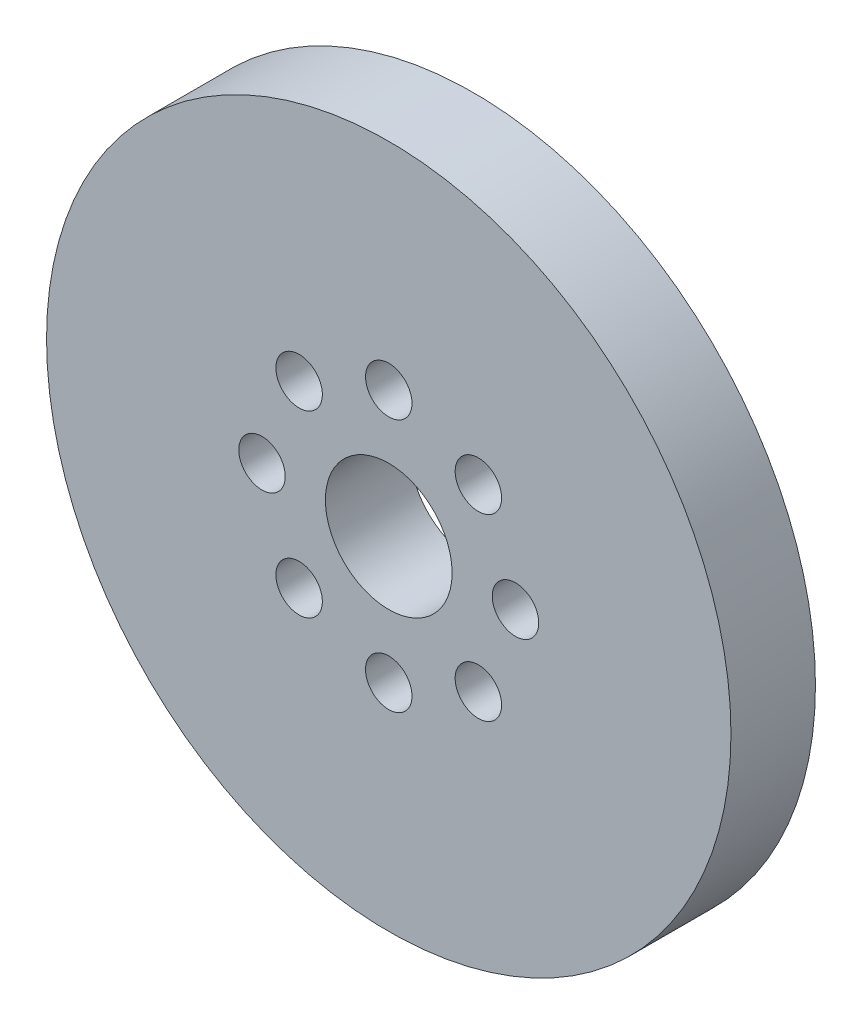
ISO-10303-21;
HEADER;
FILE_DESCRIPTION(('STEP AP214'),'2;1');
FILE_NAME('part.step','',(''),(''),'','','');
FILE_SCHEMA(('AUTOMOTIVE_DESIGN { 1 0 10303 214 1 1 1 1 }'));
ENDSEC;
DATA;
#1=APPLICATION_CONTEXT('core data for automotive mechanical design processes');
#2=APPLICATION_PROTOCOL_DEFINITION('international standard','automotive_design',2000,#1);
#3=PRODUCT_CONTEXT('',#1,'mechanical');
#4=PRODUCT('Part','Part','',(#3));
#5=PRODUCT_RELATED_PRODUCT_CATEGORY('part','',(#4));
#6=PRODUCT_DEFINITION_FORMATION('','',#4);
#7=PRODUCT_DEFINITION_CONTEXT('part definition',#1,'design');
#8=PRODUCT_DEFINITION('design','',#6,#7);
#9=PRODUCT_DEFINITION_SHAPE('','',#8);
#10=(LENGTH_UNIT() NAMED_UNIT(*) SI_UNIT(.MILLI.,.METRE.));
#11=(NAMED_UNIT(*) PLANE_ANGLE_UNIT() SI_UNIT($,.RADIAN.));
#12=(NAMED_UNIT(*) SI_UNIT($,.STERADIAN.) SOLID_ANGLE_UNIT());
#13=UNCERTAINTY_MEASURE_WITH_UNIT(LENGTH_MEASURE(1.E-05),#10,'distance_accuracy_value','');
#14=(GEOMETRIC_REPRESENTATION_CONTEXT(3) GLOBAL_UNCERTAINTY_ASSIGNED_CONTEXT((#13)) GLOBAL_UNIT_ASSIGNED_CONTEXT((#10,
#11,#12)) REPRESENTATION_CONTEXT('',''));
#15=CARTESIAN_POINT('',(0.,0.,0.));
#16=DIRECTION('',(0.,0.,1.));
#17=DIRECTION('',(1.,0.,0.));
#18=AXIS2_PLACEMENT_3D('',#15,#16,#17);
#19=CARTESIAN_POINT('',(0.,0.,10.));
#20=DIRECTION('',(0.,0.,1.));
#21=DIRECTION('',(1.,0.,0.));
#22=AXIS2_PLACEMENT_3D('',#19,#20,#21);
#23=PLANE('',#22);
#24=CARTESIAN_POINT('',(-15.,0.,10.));
#25=DIRECTION('',(0.,0.,1.));
#26=DIRECTION('',(1.,0.,0.));
#27=AXIS2_PLACEMENT_3D('',#24,#25,#26);
#28=CIRCLE('',#27,2.75);
#29=CARTESIAN_POINT('',(-12.25,0.,10.));
#30=VERTEX_POINT('',#29);
#31=EDGE_CURVE('E80',#30,#30,#28,.T.);
#32=ORIENTED_EDGE('',*,*,#31,.F.);
#33=EDGE_LOOP('',(#32));
#34=FACE_BOUND('',#33,.T.);
#35=CARTESIAN_POINT('',(-10.6066017177982,-10.6066017177983,10.));
#36=DIRECTION('',(0.,0.,1.));
#37=DIRECTION('',(1.,0.,0.));
#38=AXIS2_PLACEMENT_3D('',#35,#36,#37);
#39=CIRCLE('',#38,2.75);
#40=CARTESIAN_POINT('',(-7.85660171779816,-10.6066017177983,10.));
#41=VERTEX_POINT('',#40);
#42=EDGE_CURVE('E99',#41,#41,#39,.T.);
#43=ORIENTED_EDGE('',*,*,#42,.F.);
#44=EDGE_LOOP('',(#43));
#45=FACE_BOUND('',#44,.T.);
#46=CARTESIAN_POINT('',(0.,-15.,10.));
#47=DIRECTION('',(0.,0.,1.));
#48=DIRECTION('',(1.,0.,0.));
#49=AXIS2_PLACEMENT_3D('',#46,#47,#48);
#50=CIRCLE('',#49,2.75);
#51=CARTESIAN_POINT('',(2.75,-15.,10.));
#52=VERTEX_POINT('',#51);
#53=EDGE_CURVE('E91',#52,#52,#50,.T.);
#54=ORIENTED_EDGE('',*,*,#53,.F.);
#55=EDGE_LOOP('',(#54));
#56=FACE_BOUND('',#55,.T.);
#57=CARTESIAN_POINT('',(10.6066017177983,-10.6066017177981,10.));
#58=DIRECTION('',(0.,0.,1.));
#59=DIRECTION('',(1.,0.,0.));
#60=AXIS2_PLACEMENT_3D('',#57,#58,#59);
#61=CIRCLE('',#60,2.75);
#62=CARTESIAN_POINT('',(13.3566017177983,-10.6066017177981,10.));
#63=VERTEX_POINT('',#62);
#64=EDGE_CURVE('E81',#63,#63,#61,.T.);
#65=ORIENTED_EDGE('',*,*,#64,.F.);
#66=EDGE_LOOP('',(#65));
#67=FACE_BOUND('',#66,.T.);
#68=CARTESIAN_POINT('',(15.,1.57116660247941E-13,10.));
#69=DIRECTION('',(0.,0.,1.));
#70=DIRECTION('',(1.,0.,0.));
#71=AXIS2_PLACEMENT_3D('',#68,#69,#70);
#72=CIRCLE('',#71,2.75);
#73=CARTESIAN_POINT('',(17.75,1.57116660247941E-13,10.));
#74=VERTEX_POINT('',#73);
#75=EDGE_CURVE('E90',#74,#74,#72,.T.);
#76=ORIENTED_EDGE('',*,*,#75,.F.);
#77=EDGE_LOOP('',(#76));
#78=FACE_BOUND('',#77,.T.);
#79=CARTESIAN_POINT('',(10.6066017177981,10.6066017177983,10.));
#80=DIRECTION('',(0.,0.,1.));
#81=DIRECTION('',(1.,0.,0.));
#82=AXIS2_PLACEMENT_3D('',#79,#80,#81);
#83=CIRCLE('',#82,2.75);
#84=CARTESIAN_POINT('',(13.3566017177981,10.6066017177983,10.));
#85=VERTEX_POINT('',#84);
#86=EDGE_CURVE('E113',#85,#85,#83,.T.);
#87=ORIENTED_EDGE('',*,*,#86,.F.);
#88=EDGE_LOOP('',(#87));
#89=FACE_BOUND('',#88,.T.);
#90=CARTESIAN_POINT('',(-10.6066017177982,10.6066017177982,10.));
#91=DIRECTION('',(0.,0.,1.));
#92=DIRECTION('',(1.,0.,0.));
#93=AXIS2_PLACEMENT_3D('',#90,#91,#92);
#94=CIRCLE('',#93,2.75);
#95=CARTESIAN_POINT('',(-7.85660171779823,10.6066017177982,10.));
#96=VERTEX_POINT('',#95);
#97=EDGE_CURVE('E72',#96,#96,#94,.T.);
#98=ORIENTED_EDGE('',*,*,#97,.F.);
#99=EDGE_LOOP('',(#98));
#100=FACE_BOUND('',#99,.T.);
#101=CARTESIAN_POINT('',(0.,15.,10.));
#102=DIRECTION('',(0.,0.,1.));
#103=DIRECTION('',(1.,0.,0.));
#104=AXIS2_PLACEMENT_3D('',#101,#102,#103);
#105=CIRCLE('',#104,2.75);
#106=CARTESIAN_POINT('',(2.75,15.,10.));
#107=VERTEX_POINT('',#106);
#108=EDGE_CURVE('E61',#107,#107,#105,.T.);
#109=ORIENTED_EDGE('',*,*,#108,.F.);
#110=EDGE_LOOP('',(#109));
#111=FACE_BOUND('',#110,.T.);
#112=CARTESIAN_POINT('',(0.,0.,10.));
#113=DIRECTION('',(0.,0.,1.));
#114=DIRECTION('',(1.,0.,0.));
#115=AXIS2_PLACEMENT_3D('',#112,#113,#114);
#116=CIRCLE('',#115,40.5);
#117=CARTESIAN_POINT('',(40.5,0.,10.));
#118=VERTEX_POINT('',#117);
#119=EDGE_CURVE('E10',#118,#118,#116,.T.);
#120=ORIENTED_EDGE('',*,*,#119,.T.);
#121=EDGE_LOOP('',(#120));
#122=FACE_BOUND('',#121,.T.);
#123=CARTESIAN_POINT('',(0.,0.,10.));
#124=DIRECTION('',(0.,0.,1.));
#125=DIRECTION('',(1.,0.,0.));
#126=AXIS2_PLACEMENT_3D('',#123,#124,#125);
#127=CIRCLE('',#126,7.5);
#128=CARTESIAN_POINT('',(7.5,0.,10.));
#129=VERTEX_POINT('',#128);
#130=EDGE_CURVE('E55',#129,#129,#127,.T.);
#131=ORIENTED_EDGE('',*,*,#130,.F.);
#132=EDGE_LOOP('',(#131));
#133=FACE_BOUND('',#132,.T.);
#134=ADVANCED_FACE('F42',(#34,#45,#56,#67,#78,#89,#100,#111,#122,#133),#23,.T.);
#135=CARTESIAN_POINT('',(0.,0.,0.));
#136=DIRECTION('',(0.,0.,1.));
#137=DIRECTION('',(1.,0.,0.));
#138=AXIS2_PLACEMENT_3D('',#135,#136,#137);
#139=PLANE('',#138);
#140=CARTESIAN_POINT('',(-15.,0.,0.));
#141=DIRECTION('',(0.,0.,1.));
#142=DIRECTION('',(0.,1.,0.));
#143=AXIS2_PLACEMENT_3D('',#140,#141,#142);
#144=CIRCLE('',#143,2.75);
#145=CARTESIAN_POINT('',(-15.,2.74999999999995,0.));
#146=VERTEX_POINT('',#145);
#147=EDGE_CURVE('E103',#146,#146,#144,.T.);
#148=ORIENTED_EDGE('',*,*,#147,.T.);
#149=EDGE_LOOP('',(#148));
#150=FACE_BOUND('',#149,.T.);
#151=CARTESIAN_POINT('',(-10.6066017177982,-10.6066017177983,0.));
#152=DIRECTION('',(0.,0.,1.));
#153=DIRECTION('',(-0.707106781186551,0.707106781186544,0.));
#154=AXIS2_PLACEMENT_3D('',#151,#152,#153);
#155=CIRCLE('',#154,2.75);
#156=CARTESIAN_POINT('',(-12.5511453660612,-8.66205806953527,0.));
#157=VERTEX_POINT('',#156);
#158=EDGE_CURVE('E95',#157,#157,#155,.T.);
#159=ORIENTED_EDGE('',*,*,#158,.T.);
#160=EDGE_LOOP('',(#159));
#161=FACE_BOUND('',#160,.T.);
#162=CARTESIAN_POINT('',(0.,-15.,0.));
#163=DIRECTION('',(0.,0.,1.));
#164=DIRECTION('',(-1.,0.,0.));
#165=AXIS2_PLACEMENT_3D('',#162,#163,#164);
#166=CIRCLE('',#165,2.75);
#167=CARTESIAN_POINT('',(-2.75,-15.,0.));
#168=VERTEX_POINT('',#167);
#169=EDGE_CURVE('E85',#168,#168,#166,.T.);
#170=ORIENTED_EDGE('',*,*,#169,.T.);
#171=EDGE_LOOP('',(#170));
#172=FACE_BOUND('',#171,.T.);
#173=CARTESIAN_POINT('',(10.6066017177983,-10.6066017177981,0.));
#174=DIRECTION('',(0.,0.,1.));
#175=DIRECTION('',(-0.707106781186541,-0.707106781186554,0.));
#176=AXIS2_PLACEMENT_3D('',#173,#174,#175);
#177=CIRCLE('',#176,2.75);
#178=CARTESIAN_POINT('',(8.66205806953532,-12.5511453660611,0.));
#179=VERTEX_POINT('',#178);
#180=EDGE_CURVE('E86',#179,#179,#177,.T.);
#181=ORIENTED_EDGE('',*,*,#180,.T.);
#182=EDGE_LOOP('',(#181));
#183=FACE_BOUND('',#182,.T.);
#184=CARTESIAN_POINT('',(15.,1.57116660247941E-13,0.));
#185=DIRECTION('',(0.,0.,1.));
#186=DIRECTION('',(0.,-1.,0.));
#187=AXIS2_PLACEMENT_3D('',#184,#185,#186);
#188=CIRCLE('',#187,2.75);
#189=CARTESIAN_POINT('',(15.,-2.74999999999984,0.));
#190=VERTEX_POINT('',#189);
#191=EDGE_CURVE('E117',#190,#190,#188,.T.);
#192=ORIENTED_EDGE('',*,*,#191,.T.);
#193=EDGE_LOOP('',(#192));
#194=FACE_BOUND('',#193,.T.);
#195=CARTESIAN_POINT('',(10.6066017177981,10.6066017177983,0.));
#196=DIRECTION('',(0.,0.,1.));
#197=DIRECTION('',(0.707106781186556,-0.707106781186539,0.));
#198=AXIS2_PLACEMENT_3D('',#195,#196,#197);
#199=CIRCLE('',#198,2.75);
#200=CARTESIAN_POINT('',(12.5511453660611,8.66205806953536,0.));
#201=VERTEX_POINT('',#200);
#202=EDGE_CURVE('E118',#201,#201,#199,.T.);
#203=ORIENTED_EDGE('',*,*,#202,.T.);
#204=EDGE_LOOP('',(#203));
#205=FACE_BOUND('',#204,.T.);
#206=CARTESIAN_POINT('',(-10.6066017177982,10.6066017177982,0.));
#207=DIRECTION('',(0.,0.,1.));
#208=DIRECTION('',(0.707106781186546,0.707106781186549,0.));
#209=AXIS2_PLACEMENT_3D('',#206,#207,#208);
#210=CIRCLE('',#209,2.75);
#211=CARTESIAN_POINT('',(-8.66205806953523,12.5511453660612,0.));
#212=VERTEX_POINT('',#211);
#213=EDGE_CURVE('E76',#212,#212,#210,.T.);
#214=ORIENTED_EDGE('',*,*,#213,.T.);
#215=EDGE_LOOP('',(#214));
#216=FACE_BOUND('',#215,.T.);
#217=CARTESIAN_POINT('',(0.,15.,0.));
#218=DIRECTION('',(0.,0.,1.));
#219=DIRECTION('',(1.,0.,0.));
#220=AXIS2_PLACEMENT_3D('',#217,#218,#219);
#221=CIRCLE('',#220,2.75);
#222=CARTESIAN_POINT('',(2.75,15.,0.));
#223=VERTEX_POINT('',#222);
#224=EDGE_CURVE('E68',#223,#223,#221,.T.);
#225=ORIENTED_EDGE('',*,*,#224,.T.);
#226=EDGE_LOOP('',(#225));
#227=FACE_BOUND('',#226,.T.);
#228=CARTESIAN_POINT('',(0.,0.,0.));
#229=DIRECTION('',(0.,0.,1.));
#230=DIRECTION('',(1.,0.,0.));
#231=AXIS2_PLACEMENT_3D('',#228,#229,#230);
#232=CIRCLE('',#231,40.5);
#233=CARTESIAN_POINT('',(40.5,0.,0.));
#234=VERTEX_POINT('',#233);
#235=EDGE_CURVE('E46',#234,#234,#232,.T.);
#236=ORIENTED_EDGE('',*,*,#235,.F.);
#237=EDGE_LOOP('',(#236));
#238=FACE_BOUND('',#237,.T.);
#239=CARTESIAN_POINT('',(0.,0.,0.));
#240=DIRECTION('',(0.,0.,1.));
#241=DIRECTION('',(1.,0.,0.));
#242=AXIS2_PLACEMENT_3D('',#239,#240,#241);
#243=CIRCLE('',#242,7.5);
#244=CARTESIAN_POINT('',(7.5,0.,0.));
#245=VERTEX_POINT('',#244);
#246=EDGE_CURVE('E57',#245,#245,#243,.T.);
#247=ORIENTED_EDGE('',*,*,#246,.T.);
#248=EDGE_LOOP('',(#247));
#249=FACE_BOUND('',#248,.T.);
#250=ADVANCED_FACE('F129',(#150,#161,#172,#183,#194,#205,#216,#227,#238,#249),#139,.F.);
#251=CARTESIAN_POINT('',(0.,0.,10.));
#252=DIRECTION('',(0.,0.,-1.));
#253=DIRECTION('',(-1.,0.,0.));
#254=AXIS2_PLACEMENT_3D('',#251,#252,#253);
#255=CYLINDRICAL_SURFACE('',#254,40.5);
#256=ORIENTED_EDGE('',*,*,#119,.F.);
#257=EDGE_LOOP('',(#256));
#258=FACE_BOUND('',#257,.T.);
#259=ORIENTED_EDGE('',*,*,#235,.T.);
#260=EDGE_LOOP('',(#259));
#261=FACE_BOUND('',#260,.T.);
#262=ADVANCED_FACE('F44',(#258,#261),#255,.T.);
#263=CARTESIAN_POINT('',(0.,0.,10.));
#264=DIRECTION('',(0.,0.,-1.));
#265=DIRECTION('',(-1.,0.,0.));
#266=AXIS2_PLACEMENT_3D('',#263,#264,#265);
#267=CYLINDRICAL_SURFACE('',#266,7.5);
#268=ORIENTED_EDGE('',*,*,#130,.T.);
#269=EDGE_LOOP('',(#268));
#270=FACE_BOUND('',#269,.T.);
#271=ORIENTED_EDGE('',*,*,#246,.F.);
#272=EDGE_LOOP('',(#271));
#273=FACE_BOUND('',#272,.T.);
#274=ADVANCED_FACE('F152',(#270,#273),#267,.F.);
#275=CARTESIAN_POINT('',(0.,15.,17.778174593052));
#276=DIRECTION('',(0.,0.,-1.));
#277=DIRECTION('',(-1.,0.,0.));
#278=AXIS2_PLACEMENT_3D('',#275,#276,#277);
#279=CYLINDRICAL_SURFACE('',#278,2.75);
#280=ORIENTED_EDGE('',*,*,#224,.F.);
#281=EDGE_LOOP('',(#280));
#282=FACE_BOUND('',#281,.T.);
#283=ORIENTED_EDGE('',*,*,#108,.T.);
#284=EDGE_LOOP('',(#283));
#285=FACE_BOUND('',#284,.T.);
#286=ADVANCED_FACE('F155',(#282,#285),#279,.F.);
#287=CARTESIAN_POINT('',(-10.6066017177982,10.6066017177982,17.778174593052));
#288=DIRECTION('',(0.,0.,-1.));
#289=DIRECTION('',(-1.,0.,0.));
#290=AXIS2_PLACEMENT_3D('',#287,#288,#289);
#291=CYLINDRICAL_SURFACE('',#290,2.75);
#292=ORIENTED_EDGE('',*,*,#213,.F.);
#293=EDGE_LOOP('',(#292));
#294=FACE_BOUND('',#293,.T.);
#295=ORIENTED_EDGE('',*,*,#97,.T.);
#296=EDGE_LOOP('',(#295));
#297=FACE_BOUND('',#296,.T.);
#298=ADVANCED_FACE('F170',(#294,#297),#291,.F.);
#299=CARTESIAN_POINT('',(10.6066017177981,10.6066017177983,17.778174593052));
#300=DIRECTION('',(0.,0.,-1.));
#301=DIRECTION('',(-1.,0.,0.));
#302=AXIS2_PLACEMENT_3D('',#299,#300,#301);
#303=CYLINDRICAL_SURFACE('',#302,2.75);
#304=ORIENTED_EDGE('',*,*,#202,.F.);
#305=EDGE_LOOP('',(#304));
#306=FACE_BOUND('',#305,.T.);
#307=ORIENTED_EDGE('',*,*,#86,.T.);
#308=EDGE_LOOP('',(#307));
#309=FACE_BOUND('',#308,.T.);
#310=ADVANCED_FACE('F136',(#306,#309),#303,.F.);
#311=CARTESIAN_POINT('',(15.,1.57116660247941E-13,17.778174593052));
#312=DIRECTION('',(0.,0.,-1.));
#313=DIRECTION('',(-1.,0.,0.));
#314=AXIS2_PLACEMENT_3D('',#311,#312,#313);
#315=CYLINDRICAL_SURFACE('',#314,2.75);
#316=ORIENTED_EDGE('',*,*,#191,.F.);
#317=EDGE_LOOP('',(#316));
#318=FACE_BOUND('',#317,.T.);
#319=ORIENTED_EDGE('',*,*,#75,.T.);
#320=EDGE_LOOP('',(#319));
#321=FACE_BOUND('',#320,.T.);
#322=ADVANCED_FACE('F132',(#318,#321),#315,.F.);
#323=CARTESIAN_POINT('',(10.6066017177983,-10.6066017177981,17.778174593052));
#324=DIRECTION('',(0.,0.,-1.));
#325=DIRECTION('',(-1.,0.,0.));
#326=AXIS2_PLACEMENT_3D('',#323,#324,#325);
#327=CYLINDRICAL_SURFACE('',#326,2.75);
#328=ORIENTED_EDGE('',*,*,#180,.F.);
#329=EDGE_LOOP('',(#328));
#330=FACE_BOUND('',#329,.T.);
#331=ORIENTED_EDGE('',*,*,#64,.T.);
#332=EDGE_LOOP('',(#331));
#333=FACE_BOUND('',#332,.T.);
#334=ADVANCED_FACE('F135',(#330,#333),#327,.F.);
#335=CARTESIAN_POINT('',(0.,-15.,17.778174593052));
#336=DIRECTION('',(0.,0.,-1.));
#337=DIRECTION('',(-1.,0.,0.));
#338=AXIS2_PLACEMENT_3D('',#335,#336,#337);
#339=CYLINDRICAL_SURFACE('',#338,2.75);
#340=ORIENTED_EDGE('',*,*,#169,.F.);
#341=EDGE_LOOP('',(#340));
#342=FACE_BOUND('',#341,.T.);
#343=ORIENTED_EDGE('',*,*,#53,.T.);
#344=EDGE_LOOP('',(#343));
#345=FACE_BOUND('',#344,.T.);
#346=ADVANCED_FACE('F176',(#342,#345),#339,.F.);
#347=CARTESIAN_POINT('',(-10.6066017177982,-10.6066017177983,17.778174593052));
#348=DIRECTION('',(0.,0.,-1.));
#349=DIRECTION('',(-1.,0.,0.));
#350=AXIS2_PLACEMENT_3D('',#347,#348,#349);
#351=CYLINDRICAL_SURFACE('',#350,2.75);
#352=ORIENTED_EDGE('',*,*,#158,.F.);
#353=EDGE_LOOP('',(#352));
#354=FACE_BOUND('',#353,.T.);
#355=ORIENTED_EDGE('',*,*,#42,.T.);
#356=EDGE_LOOP('',(#355));
#357=FACE_BOUND('',#356,.T.);
#358=ADVANCED_FACE('F180',(#354,#357),#351,.F.);
#359=CARTESIAN_POINT('',(-15.,0.,17.778174593052));
#360=DIRECTION('',(0.,0.,-1.));
#361=DIRECTION('',(-1.,0.,0.));
#362=AXIS2_PLACEMENT_3D('',#359,#360,#361);
#363=CYLINDRICAL_SURFACE('',#362,2.75);
#364=ORIENTED_EDGE('',*,*,#147,.F.);
#365=EDGE_LOOP('',(#364));
#366=FACE_BOUND('',#365,.T.);
#367=ORIENTED_EDGE('',*,*,#31,.T.);
#368=EDGE_LOOP('',(#367));
#369=FACE_BOUND('',#368,.T.);
#370=ADVANCED_FACE('F184',(#366,#369),#363,.F.);
#371=CLOSED_SHELL('',(#134,#250,#262,#274,#286,#298,#310,#322,#334,#346,#358,#370));
#372=MANIFOLD_SOLID_BREP('B2',#371);
#373=ADVANCED_BREP_SHAPE_REPRESENTATION('',(#18,#372),#14);
#374=SHAPE_DEFINITION_REPRESENTATION(#9,#373);
ENDSEC;
END-ISO-10303-21;
